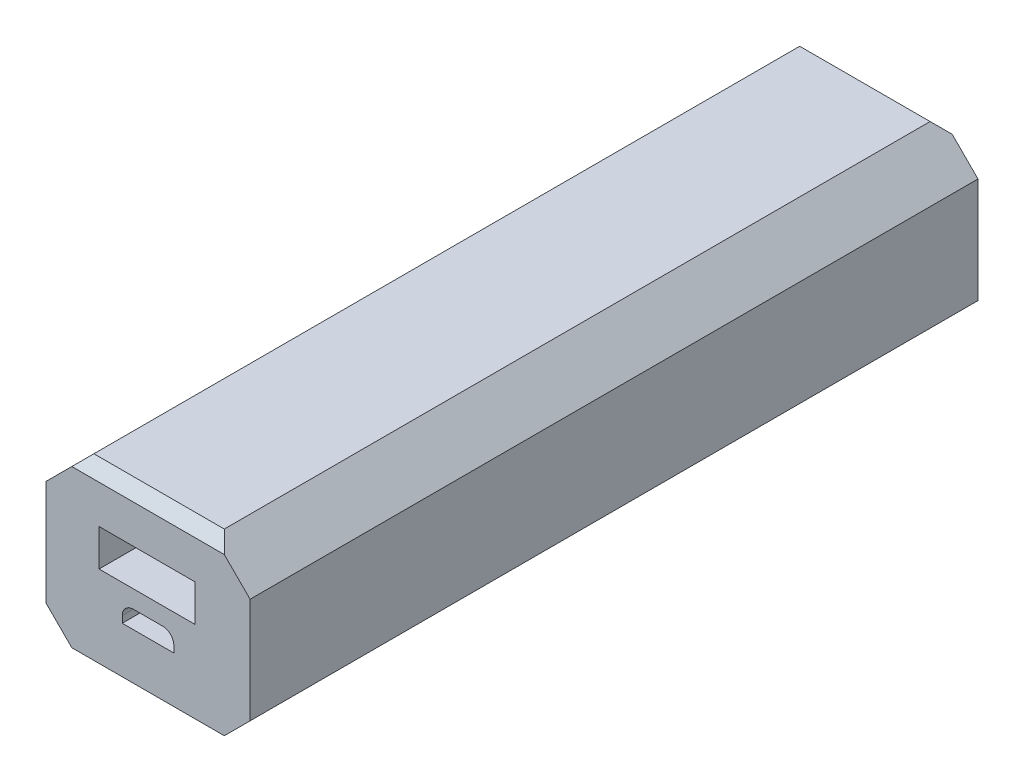
ISO-10303-21;
HEADER;
FILE_DESCRIPTION(('STEP AP214'),'2;1');
FILE_NAME('part.step','',(''),(''),'','','');
FILE_SCHEMA(('AUTOMOTIVE_DESIGN { 1 0 10303 214 1 1 1 1 }'));
ENDSEC;
DATA;
#1=APPLICATION_CONTEXT('core data for automotive mechanical design processes');
#2=APPLICATION_PROTOCOL_DEFINITION('international standard','automotive_design',2000,#1);
#3=PRODUCT_CONTEXT('',#1,'mechanical');
#4=PRODUCT('Part','Part','',(#3));
#5=PRODUCT_RELATED_PRODUCT_CATEGORY('part','',(#4));
#6=PRODUCT_DEFINITION_FORMATION('','',#4);
#7=PRODUCT_DEFINITION_CONTEXT('part definition',#1,'design');
#8=PRODUCT_DEFINITION('design','',#6,#7);
#9=PRODUCT_DEFINITION_SHAPE('','',#8);
#10=(LENGTH_UNIT() NAMED_UNIT(*) SI_UNIT(.MILLI.,.METRE.));
#11=(NAMED_UNIT(*) PLANE_ANGLE_UNIT() SI_UNIT($,.RADIAN.));
#12=(NAMED_UNIT(*) SI_UNIT($,.STERADIAN.) SOLID_ANGLE_UNIT());
#13=UNCERTAINTY_MEASURE_WITH_UNIT(LENGTH_MEASURE(1.E-05),#10,'distance_accuracy_value','');
#14=(GEOMETRIC_REPRESENTATION_CONTEXT(3) GLOBAL_UNCERTAINTY_ASSIGNED_CONTEXT((#13)) GLOBAL_UNIT_ASSIGNED_CONTEXT((#10,
#11,#12)) REPRESENTATION_CONTEXT('',''));
#15=CARTESIAN_POINT('',(0.,0.,0.));
#16=DIRECTION('',(0.,0.,1.));
#17=DIRECTION('',(1.,0.,0.));
#18=AXIS2_PLACEMENT_3D('',#15,#16,#17);
#19=CARTESIAN_POINT('',(0.,0.,98.8));
#20=DIRECTION('',(1.,0.,0.));
#21=DIRECTION('',(0.,0.,-1.));
#22=AXIS2_PLACEMENT_3D('',#19,#20,#21);
#23=PLANE('',#22);
#24=DIRECTION('',(0.,-1.,0.));
#25=VECTOR('',#24,1.);
#26=CARTESIAN_POINT('',(0.,0.,98.8));
#27=LINE('',#26,#25);
#28=CARTESIAN_POINT('',(0.,19.3,98.8));
#29=VERTEX_POINT('',#28);
#30=CARTESIAN_POINT('',(0.,5.,98.8));
#31=VERTEX_POINT('',#30);
#32=EDGE_CURVE('E286',#29,#31,#27,.T.);
#33=ORIENTED_EDGE('',*,*,#32,.F.);
#34=DIRECTION('',(0.,0.,-1.));
#35=VECTOR('',#34,1.);
#36=CARTESIAN_POINT('',(0.,19.3,98.8));
#37=LINE('',#36,#35);
#38=CARTESIAN_POINT('',(0.,19.3,0.));
#39=VERTEX_POINT('',#38);
#40=EDGE_CURVE('E304',#29,#39,#37,.T.);
#41=ORIENTED_EDGE('',*,*,#40,.T.);
#42=DIRECTION('',(0.,-1.,0.));
#43=VECTOR('',#42,1.);
#44=CARTESIAN_POINT('',(0.,0.,0.));
#45=LINE('',#44,#43);
#46=CARTESIAN_POINT('',(0.,5.,0.));
#47=VERTEX_POINT('',#46);
#48=EDGE_CURVE('E276',#39,#47,#45,.T.);
#49=ORIENTED_EDGE('',*,*,#48,.T.);
#50=DIRECTION('',(0.,0.,1.));
#51=VECTOR('',#50,1.);
#52=CARTESIAN_POINT('',(0.,5.,98.8));
#53=LINE('',#52,#51);
#54=EDGE_CURVE('E295',#47,#31,#53,.T.);
#55=ORIENTED_EDGE('',*,*,#54,.T.);
#56=EDGE_LOOP('',(#33,#41,#49,#55));
#57=FACE_BOUND('',#56,.T.);
#58=ADVANCED_FACE('F47',(#57),#23,.F.);
#59=CARTESIAN_POINT('',(0.,0.,98.8));
#60=DIRECTION('',(0.,1.,0.));
#61=DIRECTION('',(0.,0.,1.));
#62=AXIS2_PLACEMENT_3D('',#59,#60,#61);
#63=PLANE('',#62);
#64=DIRECTION('',(0.,0.,-1.));
#65=VECTOR('',#64,1.);
#66=CARTESIAN_POINT('',(4.99999999999999,0.,98.8));
#67=LINE('',#66,#65);
#68=CARTESIAN_POINT('',(4.99999999999999,0.,97.3));
#69=VERTEX_POINT('',#68);
#70=CARTESIAN_POINT('',(4.99999999999999,0.,1.49999999999999));
#71=VERTEX_POINT('',#70);
#72=EDGE_CURVE('E348',#69,#71,#67,.T.);
#73=ORIENTED_EDGE('',*,*,#72,.T.);
#74=DIRECTION('',(1.,0.,0.));
#75=VECTOR('',#74,1.);
#76=CARTESIAN_POINT('',(22.7,0.,1.49999999999999));
#77=LINE('',#76,#75);
#78=CARTESIAN_POINT('',(22.7,0.,1.49999999999999));
#79=VERTEX_POINT('',#78);
#80=EDGE_CURVE('E362',#71,#79,#77,.T.);
#81=ORIENTED_EDGE('',*,*,#80,.T.);
#82=DIRECTION('',(0.,0.,1.));
#83=VECTOR('',#82,1.);
#84=CARTESIAN_POINT('',(22.7,0.,98.8));
#85=LINE('',#84,#83);
#86=CARTESIAN_POINT('',(22.7,0.,97.3));
#87=VERTEX_POINT('',#86);
#88=EDGE_CURVE('E344',#79,#87,#85,.T.);
#89=ORIENTED_EDGE('',*,*,#88,.T.);
#90=DIRECTION('',(-1.,0.,0.));
#91=VECTOR('',#90,1.);
#92=CARTESIAN_POINT('',(0.,0.,97.3));
#93=LINE('',#92,#91);
#94=EDGE_CURVE('E359',#87,#69,#93,.T.);
#95=ORIENTED_EDGE('',*,*,#94,.T.);
#96=EDGE_LOOP('',(#73,#81,#89,#95));
#97=FACE_BOUND('',#96,.T.);
#98=ADVANCED_FACE('F449',(#97),#63,.F.);
#99=CARTESIAN_POINT('',(27.7,0.,98.8));
#100=DIRECTION('',(-1.,0.,0.));
#101=DIRECTION('',(0.,0.,1.));
#102=AXIS2_PLACEMENT_3D('',#99,#100,#101);
#103=PLANE('',#102);
#104=DIRECTION('',(0.,1.,0.));
#105=VECTOR('',#104,1.);
#106=CARTESIAN_POINT('',(27.7,0.,98.8));
#107=LINE('',#106,#105);
#108=CARTESIAN_POINT('',(27.7,4.99999999999999,98.8));
#109=VERTEX_POINT('',#108);
#110=CARTESIAN_POINT('',(27.7,19.3,98.8));
#111=VERTEX_POINT('',#110);
#112=EDGE_CURVE('E290',#109,#111,#107,.T.);
#113=ORIENTED_EDGE('',*,*,#112,.F.);
#114=DIRECTION('',(0.,0.,-1.));
#115=VECTOR('',#114,1.);
#116=CARTESIAN_POINT('',(27.7,4.99999999999999,98.8));
#117=LINE('',#116,#115);
#118=CARTESIAN_POINT('',(27.7,4.99999999999999,0.));
#119=VERTEX_POINT('',#118);
#120=EDGE_CURVE('E355',#109,#119,#117,.T.);
#121=ORIENTED_EDGE('',*,*,#120,.T.);
#122=DIRECTION('',(0.,1.,0.));
#123=VECTOR('',#122,1.);
#124=CARTESIAN_POINT('',(27.7,0.,0.));
#125=LINE('',#124,#123);
#126=CARTESIAN_POINT('',(27.7,19.3,0.));
#127=VERTEX_POINT('',#126);
#128=EDGE_CURVE('E291',#119,#127,#125,.T.);
#129=ORIENTED_EDGE('',*,*,#128,.T.);
#130=DIRECTION('',(0.,0.,1.));
#131=VECTOR('',#130,1.);
#132=CARTESIAN_POINT('',(27.7,19.3,98.8));
#133=LINE('',#132,#131);
#134=EDGE_CURVE('E352',#127,#111,#133,.T.);
#135=ORIENTED_EDGE('',*,*,#134,.T.);
#136=EDGE_LOOP('',(#113,#121,#129,#135));
#137=FACE_BOUND('',#136,.T.);
#138=ADVANCED_FACE('F456',(#137),#103,.F.);
#139=CARTESIAN_POINT('',(0.,24.3,98.8));
#140=DIRECTION('',(0.,-1.,0.));
#141=DIRECTION('',(0.,0.,-1.));
#142=AXIS2_PLACEMENT_3D('',#139,#140,#141);
#143=PLANE('',#142);
#144=DIRECTION('',(0.,0.,-1.));
#145=VECTOR('',#144,1.);
#146=CARTESIAN_POINT('',(22.7,24.3,98.8));
#147=LINE('',#146,#145);
#148=CARTESIAN_POINT('',(22.7,24.3,97.3));
#149=VERTEX_POINT('',#148);
#150=CARTESIAN_POINT('',(22.7,24.3,1.49999999999999));
#151=VERTEX_POINT('',#150);
#152=EDGE_CURVE('E322',#149,#151,#147,.T.);
#153=ORIENTED_EDGE('',*,*,#152,.T.);
#154=DIRECTION('',(-1.,0.,0.));
#155=VECTOR('',#154,1.);
#156=CARTESIAN_POINT('',(5.,24.3,1.49999999999999));
#157=LINE('',#156,#155);
#158=CARTESIAN_POINT('',(5.,24.3,1.49999999999999));
#159=VERTEX_POINT('',#158);
#160=EDGE_CURVE('E395',#151,#159,#157,.T.);
#161=ORIENTED_EDGE('',*,*,#160,.T.);
#162=DIRECTION('',(0.,0.,1.));
#163=VECTOR('',#162,1.);
#164=CARTESIAN_POINT('',(5.,24.3,98.8));
#165=LINE('',#164,#163);
#166=CARTESIAN_POINT('',(5.,24.3,97.3));
#167=VERTEX_POINT('',#166);
#168=EDGE_CURVE('E326',#159,#167,#165,.T.);
#169=ORIENTED_EDGE('',*,*,#168,.T.);
#170=DIRECTION('',(1.,0.,0.));
#171=VECTOR('',#170,1.);
#172=CARTESIAN_POINT('',(0.,24.3,97.3));
#173=LINE('',#172,#171);
#174=EDGE_CURVE('E392',#167,#149,#173,.T.);
#175=ORIENTED_EDGE('',*,*,#174,.T.);
#176=EDGE_LOOP('',(#153,#161,#169,#175));
#177=FACE_BOUND('',#176,.T.);
#178=ADVANCED_FACE('F558',(#177),#143,.F.);
#179=CARTESIAN_POINT('',(0.,0.,98.8));
#180=DIRECTION('',(0.,0.,-1.));
#181=DIRECTION('',(-1.,0.,0.));
#182=AXIS2_PLACEMENT_3D('',#179,#180,#181);
#183=PLANE('',#182);
#184=DIRECTION('',(1.,0.,0.));
#185=VECTOR('',#184,1.);
#186=CARTESIAN_POINT('',(10.35,7.8004353239189,98.8));
#187=LINE('',#186,#185);
#188=CARTESIAN_POINT('',(10.35,7.8004353239189,98.8));
#189=VERTEX_POINT('',#188);
#190=CARTESIAN_POINT('',(17.35,7.8004353239189,98.8));
#191=VERTEX_POINT('',#190);
#192=EDGE_CURVE('E229',#189,#191,#187,.T.);
#193=ORIENTED_EDGE('',*,*,#192,.F.);
#194=DIRECTION('',(0.,-1.,0.));
#195=VECTOR('',#194,1.);
#196=CARTESIAN_POINT('',(10.35,10.2004353239189,98.8));
#197=LINE('',#196,#195);
#198=CARTESIAN_POINT('',(10.35,8.7004353239189,98.8));
#199=VERTEX_POINT('',#198);
#200=EDGE_CURVE('E209',#199,#189,#197,.T.);
#201=ORIENTED_EDGE('',*,*,#200,.F.);
#202=CARTESIAN_POINT('',(11.85,8.7004353239189,98.8));
#203=DIRECTION('',(0.,0.,-1.));
#204=DIRECTION('',(-1.,0.,0.));
#205=AXIS2_PLACEMENT_3D('',#202,#203,#204);
#206=CIRCLE('',#205,1.5);
#207=CARTESIAN_POINT('',(11.85,10.2004353239189,98.8));
#208=VERTEX_POINT('',#207);
#209=EDGE_CURVE('E11',#199,#208,#206,.T.);
#210=ORIENTED_EDGE('',*,*,#209,.T.);
#211=DIRECTION('',(-1.,0.,0.));
#212=VECTOR('',#211,1.);
#213=CARTESIAN_POINT('',(10.35,10.2004353239189,98.8));
#214=LINE('',#213,#212);
#215=CARTESIAN_POINT('',(15.85,10.2004353239189,98.8));
#216=VERTEX_POINT('',#215);
#217=EDGE_CURVE('E203',#216,#208,#214,.T.);
#218=ORIENTED_EDGE('',*,*,#217,.F.);
#219=CARTESIAN_POINT('',(15.85,8.7004353239189,98.8));
#220=DIRECTION('',(0.,0.,-1.));
#221=DIRECTION('',(-1.,0.,0.));
#222=AXIS2_PLACEMENT_3D('',#219,#220,#221);
#223=CIRCLE('',#222,1.5);
#224=CARTESIAN_POINT('',(17.35,8.7004353239189,98.8));
#225=VERTEX_POINT('',#224);
#226=EDGE_CURVE('E56',#216,#225,#223,.T.);
#227=ORIENTED_EDGE('',*,*,#226,.T.);
#228=DIRECTION('',(0.,1.,0.));
#229=VECTOR('',#228,1.);
#230=CARTESIAN_POINT('',(17.35,10.2004353239189,98.8));
#231=LINE('',#230,#229);
#232=EDGE_CURVE('E232',#191,#225,#231,.T.);
#233=ORIENTED_EDGE('',*,*,#232,.F.);
#234=EDGE_LOOP('',(#193,#201,#210,#218,#227,#233));
#235=FACE_BOUND('',#234,.T.);
#236=DIRECTION('',(1.,0.,0.));
#237=VECTOR('',#236,1.);
#238=CARTESIAN_POINT('',(7.2,12.6004353239189,98.8));
#239=LINE('',#238,#237);
#240=CARTESIAN_POINT('',(7.2,12.6004353239189,98.8));
#241=VERTEX_POINT('',#240);
#242=CARTESIAN_POINT('',(20.2,12.6004353239189,98.8));
#243=VERTEX_POINT('',#242);
#244=EDGE_CURVE('E262',#241,#243,#239,.T.);
#245=ORIENTED_EDGE('',*,*,#244,.F.);
#246=DIRECTION('',(0.,-1.,0.));
#247=VECTOR('',#246,1.);
#248=CARTESIAN_POINT('',(7.2,17.6004353239189,98.8));
#249=LINE('',#248,#247);
#250=CARTESIAN_POINT('',(7.2,17.6004353239189,98.8));
#251=VERTEX_POINT('',#250);
#252=EDGE_CURVE('E240',#251,#241,#249,.T.);
#253=ORIENTED_EDGE('',*,*,#252,.F.);
#254=DIRECTION('',(-1.,0.,0.));
#255=VECTOR('',#254,1.);
#256=CARTESIAN_POINT('',(7.2,17.6004353239189,98.8));
#257=LINE('',#256,#255);
#258=CARTESIAN_POINT('',(20.2,17.6004353239189,98.8));
#259=VERTEX_POINT('',#258);
#260=EDGE_CURVE('E247',#259,#251,#257,.T.);
#261=ORIENTED_EDGE('',*,*,#260,.F.);
#262=DIRECTION('',(0.,1.,0.));
#263=VECTOR('',#262,1.);
#264=CARTESIAN_POINT('',(20.2,17.6004353239189,98.8));
#265=LINE('',#264,#263);
#266=EDGE_CURVE('E266',#243,#259,#265,.T.);
#267=ORIENTED_EDGE('',*,*,#266,.F.);
#268=EDGE_LOOP('',(#245,#253,#261,#267));
#269=FACE_BOUND('',#268,.T.);
#270=DIRECTION('',(-0.707106781186547,0.707106781186549,0.));
#271=VECTOR('',#270,1.);
#272=CARTESIAN_POINT('',(4.99999999999999,0.,98.8));
#273=LINE('',#272,#271);
#274=CARTESIAN_POINT('',(3.50000000000001,1.49999999999999,98.8));
#275=VERTEX_POINT('',#274);
#276=EDGE_CURVE('E337',#31,#275,#273,.F.);
#277=ORIENTED_EDGE('',*,*,#276,.T.);
#278=DIRECTION('',(1.,0.,0.));
#279=VECTOR('',#278,1.);
#280=CARTESIAN_POINT('',(0.,1.49999999999999,98.8));
#281=LINE('',#280,#279);
#282=CARTESIAN_POINT('',(24.2,1.49999999999999,98.8));
#283=VERTEX_POINT('',#282);
#284=EDGE_CURVE('E388',#275,#283,#281,.T.);
#285=ORIENTED_EDGE('',*,*,#284,.T.);
#286=DIRECTION('',(-0.707106781186549,-0.707106781186547,0.));
#287=VECTOR('',#286,1.);
#288=CARTESIAN_POINT('',(27.7,4.99999999999999,98.8));
#289=LINE('',#288,#287);
#290=EDGE_CURVE('E334',#283,#109,#289,.F.);
#291=ORIENTED_EDGE('',*,*,#290,.T.);
#292=ORIENTED_EDGE('',*,*,#112,.T.);
#293=DIRECTION('',(0.707106781186547,-0.707106781186549,0.));
#294=VECTOR('',#293,1.);
#295=CARTESIAN_POINT('',(22.7,24.3,98.8));
#296=LINE('',#295,#294);
#297=CARTESIAN_POINT('',(24.2,22.8,98.8));
#298=VERTEX_POINT('',#297);
#299=EDGE_CURVE('E330',#111,#298,#296,.F.);
#300=ORIENTED_EDGE('',*,*,#299,.T.);
#301=DIRECTION('',(-1.,0.,0.));
#302=VECTOR('',#301,1.);
#303=CARTESIAN_POINT('',(0.,22.8,98.8));
#304=LINE('',#303,#302);
#305=CARTESIAN_POINT('',(3.50000000000001,22.8,98.8));
#306=VERTEX_POINT('',#305);
#307=EDGE_CURVE('E384',#298,#306,#304,.T.);
#308=ORIENTED_EDGE('',*,*,#307,.T.);
#309=DIRECTION('',(0.707106781186549,0.707106781186547,0.));
#310=VECTOR('',#309,1.);
#311=CARTESIAN_POINT('',(0.,19.3,98.8));
#312=LINE('',#311,#310);
#313=EDGE_CURVE('E341',#306,#29,#312,.F.);
#314=ORIENTED_EDGE('',*,*,#313,.T.);
#315=ORIENTED_EDGE('',*,*,#32,.T.);
#316=EDGE_LOOP('',(#277,#285,#291,#292,#300,#308,#314,#315));
#317=FACE_BOUND('',#316,.T.);
#318=ADVANCED_FACE('F432',(#235,#269,#317),#183,.F.);
#319=CARTESIAN_POINT('',(0.,0.,0.));
#320=DIRECTION('',(0.,0.,-1.));
#321=DIRECTION('',(-1.,0.,0.));
#322=AXIS2_PLACEMENT_3D('',#319,#320,#321);
#323=PLANE('',#322);
#324=DIRECTION('',(0.707106781186549,0.707106781186547,0.));
#325=VECTOR('',#324,1.);
#326=CARTESIAN_POINT('',(11.35,-11.35,0.));
#327=LINE('',#326,#325);
#328=CARTESIAN_POINT('',(24.2,1.5,0.));
#329=VERTEX_POINT('',#328);
#330=EDGE_CURVE('E311',#119,#329,#327,.F.);
#331=ORIENTED_EDGE('',*,*,#330,.T.);
#332=DIRECTION('',(-1.,0.,0.));
#333=VECTOR('',#332,1.);
#334=CARTESIAN_POINT('',(4.99999999999999,1.5,0.));
#335=LINE('',#334,#333);
#336=CARTESIAN_POINT('',(3.49999999999999,1.5,0.));
#337=VERTEX_POINT('',#336);
#338=EDGE_CURVE('E375',#329,#337,#335,.T.);
#339=ORIENTED_EDGE('',*,*,#338,.T.);
#340=DIRECTION('',(0.707106781186547,-0.707106781186549,0.));
#341=VECTOR('',#340,1.);
#342=CARTESIAN_POINT('',(2.5,2.5,0.));
#343=LINE('',#342,#341);
#344=EDGE_CURVE('E315',#337,#47,#343,.F.);
#345=ORIENTED_EDGE('',*,*,#344,.T.);
#346=ORIENTED_EDGE('',*,*,#48,.F.);
#347=DIRECTION('',(-0.707106781186549,-0.707106781186547,0.));
#348=VECTOR('',#347,1.);
#349=CARTESIAN_POINT('',(-9.65000000000001,9.65000000000004,0.));
#350=LINE('',#349,#348);
#351=CARTESIAN_POINT('',(3.5,22.8,0.));
#352=VERTEX_POINT('',#351);
#353=EDGE_CURVE('E318',#39,#352,#350,.F.);
#354=ORIENTED_EDGE('',*,*,#353,.T.);
#355=DIRECTION('',(1.,0.,0.));
#356=VECTOR('',#355,1.);
#357=CARTESIAN_POINT('',(22.7,22.8,0.));
#358=LINE('',#357,#356);
#359=CARTESIAN_POINT('',(24.2,22.8,0.));
#360=VERTEX_POINT('',#359);
#361=EDGE_CURVE('E372',#352,#360,#358,.T.);
#362=ORIENTED_EDGE('',*,*,#361,.T.);
#363=DIRECTION('',(-0.707106781186547,0.707106781186549,0.));
#364=VECTOR('',#363,1.);
#365=CARTESIAN_POINT('',(23.5,23.5,0.));
#366=LINE('',#365,#364);
#367=EDGE_CURVE('E308',#360,#127,#366,.F.);
#368=ORIENTED_EDGE('',*,*,#367,.T.);
#369=ORIENTED_EDGE('',*,*,#128,.F.);
#370=EDGE_LOOP('',(#331,#339,#345,#346,#354,#362,#368,#369));
#371=FACE_BOUND('',#370,.T.);
#372=ADVANCED_FACE('F470',(#371),#323,.T.);
#373=CARTESIAN_POINT('',(0.,19.3,98.8));
#374=DIRECTION('',(0.707106781186546,-0.707106781186548,0.));
#375=DIRECTION('',(0.,0.,-1.));
#376=AXIS2_PLACEMENT_3D('',#373,#374,#375);
#377=PLANE('',#376);
#378=ORIENTED_EDGE('',*,*,#168,.F.);
#379=DIRECTION('',(0.577350269189629,0.577350269189627,0.577350269189622));
#380=VECTOR('',#379,1.);
#381=CARTESIAN_POINT('',(34.0999999999999,53.3999999999998,30.5999999999996));
#382=LINE('',#381,#380);
#383=EDGE_CURVE('E402',#159,#352,#382,.F.);
#384=ORIENTED_EDGE('',*,*,#383,.T.);
#385=ORIENTED_EDGE('',*,*,#353,.F.);
#386=ORIENTED_EDGE('',*,*,#40,.F.);
#387=ORIENTED_EDGE('',*,*,#313,.F.);
#388=DIRECTION('',(0.577350269189625,0.577350269189623,-0.577350269189629));
#389=VECTOR('',#388,1.);
#390=CARTESIAN_POINT('',(1.16666666666668,20.4666666666667,101.133333333333));
#391=LINE('',#390,#389);
#392=EDGE_CURVE('E399',#306,#167,#391,.T.);
#393=ORIENTED_EDGE('',*,*,#392,.T.);
#394=EDGE_LOOP('',(#378,#384,#385,#386,#387,#393));
#395=FACE_BOUND('',#394,.T.);
#396=ADVANCED_FACE('F463',(#395),#377,.F.);
#397=CARTESIAN_POINT('',(4.99999999999999,0.,98.8));
#398=DIRECTION('',(0.707106781186548,0.707106781186546,0.));
#399=DIRECTION('',(0.,0.,-1.));
#400=AXIS2_PLACEMENT_3D('',#397,#398,#399);
#401=PLANE('',#400);
#402=ORIENTED_EDGE('',*,*,#344,.F.);
#403=DIRECTION('',(-0.577350269189627,0.577350269189628,-0.577350269189623));
#404=VECTOR('',#403,1.);
#405=CARTESIAN_POINT('',(37.4333333333332,-32.4333333333333,33.933333333333));
#406=LINE('',#405,#404);
#407=EDGE_CURVE('E381',#337,#71,#406,.F.);
#408=ORIENTED_EDGE('',*,*,#407,.T.);
#409=ORIENTED_EDGE('',*,*,#72,.F.);
#410=DIRECTION('',(-0.577350269189623,0.577350269189625,0.57735026918963));
#411=VECTOR('',#410,1.);
#412=CARTESIAN_POINT('',(4.49999999999999,0.500000000000003,97.8));
#413=LINE('',#412,#411);
#414=EDGE_CURVE('E378',#69,#275,#413,.T.);
#415=ORIENTED_EDGE('',*,*,#414,.T.);
#416=ORIENTED_EDGE('',*,*,#276,.F.);
#417=ORIENTED_EDGE('',*,*,#54,.F.);
#418=EDGE_LOOP('',(#402,#408,#409,#415,#416,#417));
#419=FACE_BOUND('',#418,.T.);
#420=ADVANCED_FACE('F469',(#419),#401,.F.);
#421=CARTESIAN_POINT('',(27.7,4.99999999999999,98.8));
#422=DIRECTION('',(-0.707106781186546,0.707106781186548,0.));
#423=DIRECTION('',(0.,0.,-1.));
#424=AXIS2_PLACEMENT_3D('',#421,#422,#423);
#425=PLANE('',#424);
#426=ORIENTED_EDGE('',*,*,#88,.F.);
#427=DIRECTION('',(-0.577350269189629,-0.577350269189627,0.577350269189622));
#428=VECTOR('',#427,1.);
#429=CARTESIAN_POINT('',(-6.39999999999991,-29.0999999999998,30.5999999999996));
#430=LINE('',#429,#428);
#431=EDGE_CURVE('E369',#79,#329,#430,.F.);
#432=ORIENTED_EDGE('',*,*,#431,.T.);
#433=ORIENTED_EDGE('',*,*,#330,.F.);
#434=ORIENTED_EDGE('',*,*,#120,.F.);
#435=ORIENTED_EDGE('',*,*,#290,.F.);
#436=DIRECTION('',(-0.577350269189625,-0.577350269189623,-0.577350269189629));
#437=VECTOR('',#436,1.);
#438=CARTESIAN_POINT('',(26.5333333333333,3.83333333333331,101.133333333333));
#439=LINE('',#438,#437);
#440=EDGE_CURVE('E366',#283,#87,#439,.T.);
#441=ORIENTED_EDGE('',*,*,#440,.T.);
#442=EDGE_LOOP('',(#426,#432,#433,#434,#435,#441));
#443=FACE_BOUND('',#442,.T.);
#444=ADVANCED_FACE('F477',(#443),#425,.F.);
#445=CARTESIAN_POINT('',(22.7,24.3,98.8));
#446=DIRECTION('',(-0.707106781186548,-0.707106781186546,0.));
#447=DIRECTION('',(0.,0.,-1.));
#448=AXIS2_PLACEMENT_3D('',#445,#446,#447);
#449=PLANE('',#448);
#450=ORIENTED_EDGE('',*,*,#367,.F.);
#451=DIRECTION('',(0.577350269189627,-0.577350269189628,-0.577350269189623));
#452=VECTOR('',#451,1.);
#453=CARTESIAN_POINT('',(-9.73333333333321,56.7333333333333,33.933333333333));
#454=LINE('',#453,#452);
#455=EDGE_CURVE('E408',#360,#151,#454,.F.);
#456=ORIENTED_EDGE('',*,*,#455,.T.);
#457=ORIENTED_EDGE('',*,*,#152,.F.);
#458=DIRECTION('',(0.577350269189623,-0.577350269189625,0.57735026918963));
#459=VECTOR('',#458,1.);
#460=CARTESIAN_POINT('',(23.2,23.8,97.8));
#461=LINE('',#460,#459);
#462=EDGE_CURVE('E405',#149,#298,#461,.T.);
#463=ORIENTED_EDGE('',*,*,#462,.T.);
#464=ORIENTED_EDGE('',*,*,#299,.F.);
#465=ORIENTED_EDGE('',*,*,#134,.F.);
#466=EDGE_LOOP('',(#450,#456,#457,#463,#464,#465));
#467=FACE_BOUND('',#466,.T.);
#468=ADVANCED_FACE('F484',(#467),#449,.F.);
#469=CARTESIAN_POINT('',(0.,0.,1.49999999999999));
#470=DIRECTION('',(0.,-0.707106781186544,-0.707106781186551));
#471=DIRECTION('',(-1.,0.,0.));
#472=AXIS2_PLACEMENT_3D('',#469,#470,#471);
#473=PLANE('',#472);
#474=ORIENTED_EDGE('',*,*,#407,.F.);
#475=ORIENTED_EDGE('',*,*,#338,.F.);
#476=ORIENTED_EDGE('',*,*,#431,.F.);
#477=ORIENTED_EDGE('',*,*,#80,.F.);
#478=EDGE_LOOP('',(#474,#475,#476,#477));
#479=FACE_BOUND('',#478,.T.);
#480=ADVANCED_FACE('F491',(#479),#473,.T.);
#481=CARTESIAN_POINT('',(0.,1.49999999999999,98.8));
#482=DIRECTION('',(0.,0.707106781186551,-0.707106781186544));
#483=DIRECTION('',(1.,0.,0.));
#484=AXIS2_PLACEMENT_3D('',#481,#482,#483);
#485=PLANE('',#484);
#486=ORIENTED_EDGE('',*,*,#414,.F.);
#487=ORIENTED_EDGE('',*,*,#94,.F.);
#488=ORIENTED_EDGE('',*,*,#440,.F.);
#489=ORIENTED_EDGE('',*,*,#284,.F.);
#490=EDGE_LOOP('',(#486,#487,#488,#489));
#491=FACE_BOUND('',#490,.T.);
#492=ADVANCED_FACE('F498',(#491),#485,.F.);
#493=CARTESIAN_POINT('',(0.,24.3,1.49999999999999));
#494=DIRECTION('',(0.,0.707106781186544,-0.707106781186551));
#495=DIRECTION('',(1.,0.,0.));
#496=AXIS2_PLACEMENT_3D('',#493,#494,#495);
#497=PLANE('',#496);
#498=ORIENTED_EDGE('',*,*,#455,.F.);
#499=ORIENTED_EDGE('',*,*,#361,.F.);
#500=ORIENTED_EDGE('',*,*,#383,.F.);
#501=ORIENTED_EDGE('',*,*,#160,.F.);
#502=EDGE_LOOP('',(#498,#499,#500,#501));
#503=FACE_BOUND('',#502,.T.);
#504=ADVANCED_FACE('F505',(#503),#497,.T.);
#505=CARTESIAN_POINT('',(0.,22.8,98.8));
#506=DIRECTION('',(0.,-0.707106781186551,-0.707106781186544));
#507=DIRECTION('',(-1.,0.,0.));
#508=AXIS2_PLACEMENT_3D('',#505,#506,#507);
#509=PLANE('',#508);
#510=ORIENTED_EDGE('',*,*,#462,.F.);
#511=ORIENTED_EDGE('',*,*,#174,.F.);
#512=ORIENTED_EDGE('',*,*,#392,.F.);
#513=ORIENTED_EDGE('',*,*,#307,.F.);
#514=EDGE_LOOP('',(#510,#511,#512,#513));
#515=FACE_BOUND('',#514,.T.);
#516=ADVANCED_FACE('F512',(#515),#509,.F.);
#517=CARTESIAN_POINT('',(7.2,17.6004353239189,83.8));
#518=DIRECTION('',(-1.,0.,0.));
#519=DIRECTION('',(0.,-1.,0.));
#520=AXIS2_PLACEMENT_3D('',#517,#518,#519);
#521=PLANE('',#520);
#522=ORIENTED_EDGE('',*,*,#252,.T.);
#523=DIRECTION('',(0.,0.,1.));
#524=VECTOR('',#523,1.);
#525=CARTESIAN_POINT('',(7.2,12.6004353239189,83.8));
#526=LINE('',#525,#524);
#527=CARTESIAN_POINT('',(7.2,12.6004353239189,83.8));
#528=VERTEX_POINT('',#527);
#529=EDGE_CURVE('E259',#528,#241,#526,.T.);
#530=ORIENTED_EDGE('',*,*,#529,.F.);
#531=DIRECTION('',(0.,-1.,0.));
#532=VECTOR('',#531,1.);
#533=CARTESIAN_POINT('',(7.2,17.6004353239189,83.8));
#534=LINE('',#533,#532);
#535=CARTESIAN_POINT('',(7.2,17.6004353239189,83.8));
#536=VERTEX_POINT('',#535);
#537=EDGE_CURVE('E242',#536,#528,#534,.T.);
#538=ORIENTED_EDGE('',*,*,#537,.F.);
#539=DIRECTION('',(0.,0.,1.));
#540=VECTOR('',#539,1.);
#541=CARTESIAN_POINT('',(7.2,17.6004353239189,83.8));
#542=LINE('',#541,#540);
#543=EDGE_CURVE('E273',#536,#251,#542,.T.);
#544=ORIENTED_EDGE('',*,*,#543,.T.);
#545=EDGE_LOOP('',(#522,#530,#538,#544));
#546=FACE_BOUND('',#545,.T.);
#547=ADVANCED_FACE('F517',(#546),#521,.F.);
#548=CARTESIAN_POINT('',(7.2,17.6004353239189,83.8));
#549=DIRECTION('',(0.,1.,0.));
#550=DIRECTION('',(0.,0.,1.));
#551=AXIS2_PLACEMENT_3D('',#548,#549,#550);
#552=PLANE('',#551);
#553=ORIENTED_EDGE('',*,*,#260,.T.);
#554=ORIENTED_EDGE('',*,*,#543,.F.);
#555=DIRECTION('',(-1.,0.,0.));
#556=VECTOR('',#555,1.);
#557=CARTESIAN_POINT('',(7.2,17.6004353239189,83.8));
#558=LINE('',#557,#556);
#559=CARTESIAN_POINT('',(20.2,17.6004353239189,83.8));
#560=VERTEX_POINT('',#559);
#561=EDGE_CURVE('E255',#560,#536,#558,.T.);
#562=ORIENTED_EDGE('',*,*,#561,.F.);
#563=DIRECTION('',(0.,0.,1.));
#564=VECTOR('',#563,1.);
#565=CARTESIAN_POINT('',(20.2,17.6004353239189,83.8));
#566=LINE('',#565,#564);
#567=EDGE_CURVE('E277',#560,#259,#566,.T.);
#568=ORIENTED_EDGE('',*,*,#567,.T.);
#569=EDGE_LOOP('',(#553,#554,#562,#568));
#570=FACE_BOUND('',#569,.T.);
#571=ADVANCED_FACE('F522',(#570),#552,.F.);
#572=CARTESIAN_POINT('',(20.2,17.6004353239189,83.8));
#573=DIRECTION('',(1.,0.,0.));
#574=DIRECTION('',(0.,0.,-1.));
#575=AXIS2_PLACEMENT_3D('',#572,#573,#574);
#576=PLANE('',#575);
#577=ORIENTED_EDGE('',*,*,#266,.T.);
#578=ORIENTED_EDGE('',*,*,#567,.F.);
#579=DIRECTION('',(0.,1.,0.));
#580=VECTOR('',#579,1.);
#581=CARTESIAN_POINT('',(20.2,17.6004353239189,83.8));
#582=LINE('',#581,#580);
#583=CARTESIAN_POINT('',(20.2,12.6004353239189,83.8));
#584=VERTEX_POINT('',#583);
#585=EDGE_CURVE('E251',#584,#560,#582,.T.);
#586=ORIENTED_EDGE('',*,*,#585,.F.);
#587=DIRECTION('',(0.,0.,1.));
#588=VECTOR('',#587,1.);
#589=CARTESIAN_POINT('',(20.2,12.6004353239189,83.8));
#590=LINE('',#589,#588);
#591=EDGE_CURVE('E280',#584,#243,#590,.T.);
#592=ORIENTED_EDGE('',*,*,#591,.T.);
#593=EDGE_LOOP('',(#577,#578,#586,#592));
#594=FACE_BOUND('',#593,.T.);
#595=ADVANCED_FACE('F572',(#594),#576,.F.);
#596=CARTESIAN_POINT('',(7.2,12.6004353239189,83.8));
#597=DIRECTION('',(0.,-1.,0.));
#598=DIRECTION('',(0.,0.,-1.));
#599=AXIS2_PLACEMENT_3D('',#596,#597,#598);
#600=PLANE('',#599);
#601=ORIENTED_EDGE('',*,*,#244,.T.);
#602=ORIENTED_EDGE('',*,*,#591,.F.);
#603=DIRECTION('',(1.,0.,0.));
#604=VECTOR('',#603,1.);
#605=CARTESIAN_POINT('',(7.2,12.6004353239189,83.8));
#606=LINE('',#605,#604);
#607=EDGE_CURVE('E246',#528,#584,#606,.T.);
#608=ORIENTED_EDGE('',*,*,#607,.F.);
#609=ORIENTED_EDGE('',*,*,#529,.T.);
#610=EDGE_LOOP('',(#601,#602,#608,#609));
#611=FACE_BOUND('',#610,.T.);
#612=ADVANCED_FACE('F568',(#611),#600,.F.);
#613=CARTESIAN_POINT('',(0.,0.,83.8));
#614=DIRECTION('',(0.,0.,1.));
#615=DIRECTION('',(1.,0.,0.));
#616=AXIS2_PLACEMENT_3D('',#613,#614,#615);
#617=PLANE('',#616);
#618=ORIENTED_EDGE('',*,*,#537,.T.);
#619=ORIENTED_EDGE('',*,*,#607,.T.);
#620=ORIENTED_EDGE('',*,*,#585,.T.);
#621=ORIENTED_EDGE('',*,*,#561,.T.);
#622=EDGE_LOOP('',(#618,#619,#620,#621));
#623=FACE_BOUND('',#622,.T.);
#624=ADVANCED_FACE('F571',(#623),#617,.T.);
#625=CARTESIAN_POINT('',(10.35,10.2004353239189,88.8));
#626=DIRECTION('',(-1.,0.,0.));
#627=DIRECTION('',(0.,0.,1.));
#628=AXIS2_PLACEMENT_3D('',#625,#626,#627);
#629=PLANE('',#628);
#630=DIRECTION('',(0.,-1.,0.));
#631=VECTOR('',#630,1.);
#632=CARTESIAN_POINT('',(10.35,10.2004353239189,88.8));
#633=LINE('',#632,#631);
#634=CARTESIAN_POINT('',(10.35,8.7004353239189,88.8));
#635=VERTEX_POINT('',#634);
#636=CARTESIAN_POINT('',(10.35,7.8004353239189,88.8));
#637=VERTEX_POINT('',#636);
#638=EDGE_CURVE('E195',#635,#637,#633,.T.);
#639=ORIENTED_EDGE('',*,*,#638,.F.);
#640=DIRECTION('',(0.,0.,1.));
#641=VECTOR('',#640,1.);
#642=CARTESIAN_POINT('',(10.35,8.7004353239189,98.8));
#643=LINE('',#642,#641);
#644=EDGE_CURVE('E426',#635,#199,#643,.T.);
#645=ORIENTED_EDGE('',*,*,#644,.T.);
#646=ORIENTED_EDGE('',*,*,#200,.T.);
#647=DIRECTION('',(0.,0.,1.));
#648=VECTOR('',#647,1.);
#649=CARTESIAN_POINT('',(10.35,7.8004353239189,88.8));
#650=LINE('',#649,#648);
#651=EDGE_CURVE('E206',#637,#189,#650,.T.);
#652=ORIENTED_EDGE('',*,*,#651,.F.);
#653=EDGE_LOOP('',(#639,#645,#646,#652));
#654=FACE_BOUND('',#653,.T.);
#655=ADVANCED_FACE('F207',(#654),#629,.F.);
#656=CARTESIAN_POINT('',(10.35,10.2004353239189,88.8));
#657=DIRECTION('',(0.,1.,0.));
#658=DIRECTION('',(0.,0.,1.));
#659=AXIS2_PLACEMENT_3D('',#656,#657,#658);
#660=PLANE('',#659);
#661=DIRECTION('',(-1.,0.,0.));
#662=VECTOR('',#661,1.);
#663=CARTESIAN_POINT('',(10.35,10.2004353239189,88.8));
#664=LINE('',#663,#662);
#665=CARTESIAN_POINT('',(15.85,10.2004353239189,88.8));
#666=VERTEX_POINT('',#665);
#667=CARTESIAN_POINT('',(11.85,10.2004353239189,88.8));
#668=VERTEX_POINT('',#667);
#669=EDGE_CURVE('E215',#666,#668,#664,.T.);
#670=ORIENTED_EDGE('',*,*,#669,.F.);
#671=DIRECTION('',(0.,0.,1.));
#672=VECTOR('',#671,1.);
#673=CARTESIAN_POINT('',(15.85,10.2004353239189,98.8));
#674=LINE('',#673,#672);
#675=EDGE_CURVE('E414',#666,#216,#674,.T.);
#676=ORIENTED_EDGE('',*,*,#675,.T.);
#677=ORIENTED_EDGE('',*,*,#217,.T.);
#678=DIRECTION('',(0.,0.,1.));
#679=VECTOR('',#678,1.);
#680=CARTESIAN_POINT('',(11.85,10.2004353239189,88.8));
#681=LINE('',#680,#679);
#682=EDGE_CURVE('E411',#208,#668,#681,.F.);
#683=ORIENTED_EDGE('',*,*,#682,.T.);
#684=EDGE_LOOP('',(#670,#676,#677,#683));
#685=FACE_BOUND('',#684,.T.);
#686=ADVANCED_FACE('F443',(#685),#660,.F.);
#687=CARTESIAN_POINT('',(17.35,10.2004353239189,88.8));
#688=DIRECTION('',(1.,0.,0.));
#689=DIRECTION('',(0.,0.,-1.));
#690=AXIS2_PLACEMENT_3D('',#687,#688,#689);
#691=PLANE('',#690);
#692=ORIENTED_EDGE('',*,*,#232,.T.);
#693=DIRECTION('',(0.,0.,1.));
#694=VECTOR('',#693,1.);
#695=CARTESIAN_POINT('',(17.35,8.7004353239189,88.8));
#696=LINE('',#695,#694);
#697=CARTESIAN_POINT('',(17.35,8.7004353239189,88.8));
#698=VERTEX_POINT('',#697);
#699=EDGE_CURVE('E418',#225,#698,#696,.F.);
#700=ORIENTED_EDGE('',*,*,#699,.T.);
#701=DIRECTION('',(0.,1.,0.));
#702=VECTOR('',#701,1.);
#703=CARTESIAN_POINT('',(17.35,10.2004353239189,88.8));
#704=LINE('',#703,#702);
#705=CARTESIAN_POINT('',(17.35,7.8004353239189,88.8));
#706=VERTEX_POINT('',#705);
#707=EDGE_CURVE('E220',#706,#698,#704,.T.);
#708=ORIENTED_EDGE('',*,*,#707,.F.);
#709=DIRECTION('',(0.,0.,1.));
#710=VECTOR('',#709,1.);
#711=CARTESIAN_POINT('',(17.35,7.8004353239189,88.8));
#712=LINE('',#711,#710);
#713=EDGE_CURVE('E214',#706,#191,#712,.T.);
#714=ORIENTED_EDGE('',*,*,#713,.T.);
#715=EDGE_LOOP('',(#692,#700,#708,#714));
#716=FACE_BOUND('',#715,.T.);
#717=ADVANCED_FACE('F438',(#716),#691,.F.);
#718=CARTESIAN_POINT('',(10.35,7.8004353239189,88.8));
#719=DIRECTION('',(0.,-1.,0.));
#720=DIRECTION('',(0.,0.,-1.));
#721=AXIS2_PLACEMENT_3D('',#718,#719,#720);
#722=PLANE('',#721);
#723=ORIENTED_EDGE('',*,*,#192,.T.);
#724=ORIENTED_EDGE('',*,*,#713,.F.);
#725=DIRECTION('',(1.,0.,0.));
#726=VECTOR('',#725,1.);
#727=CARTESIAN_POINT('',(10.35,7.8004353239189,88.8));
#728=LINE('',#727,#726);
#729=EDGE_CURVE('E200',#637,#706,#728,.T.);
#730=ORIENTED_EDGE('',*,*,#729,.F.);
#731=ORIENTED_EDGE('',*,*,#651,.T.);
#732=EDGE_LOOP('',(#723,#724,#730,#731));
#733=FACE_BOUND('',#732,.T.);
#734=ADVANCED_FACE('F217',(#733),#722,.F.);
#735=CARTESIAN_POINT('',(0.,0.,88.8));
#736=DIRECTION('',(0.,0.,1.));
#737=DIRECTION('',(1.,0.,0.));
#738=AXIS2_PLACEMENT_3D('',#735,#736,#737);
#739=PLANE('',#738);
#740=ORIENTED_EDGE('',*,*,#707,.T.);
#741=CARTESIAN_POINT('',(15.85,8.7004353239189,88.8));
#742=DIRECTION('',(0.,0.,1.));
#743=DIRECTION('',(1.,0.,0.));
#744=AXIS2_PLACEMENT_3D('',#741,#742,#743);
#745=CIRCLE('',#744,1.5);
#746=EDGE_CURVE('E423',#698,#666,#745,.T.);
#747=ORIENTED_EDGE('',*,*,#746,.T.);
#748=ORIENTED_EDGE('',*,*,#669,.T.);
#749=CARTESIAN_POINT('',(11.85,8.7004353239189,88.8));
#750=DIRECTION('',(0.,0.,1.));
#751=DIRECTION('',(1.,0.,0.));
#752=AXIS2_PLACEMENT_3D('',#749,#750,#751);
#753=CIRCLE('',#752,1.5);
#754=EDGE_CURVE('E69',#668,#635,#753,.T.);
#755=ORIENTED_EDGE('',*,*,#754,.T.);
#756=ORIENTED_EDGE('',*,*,#638,.T.);
#757=ORIENTED_EDGE('',*,*,#729,.T.);
#758=EDGE_LOOP('',(#740,#747,#748,#755,#756,#757));
#759=FACE_BOUND('',#758,.T.);
#760=ADVANCED_FACE('F198',(#759),#739,.T.);
#761=CARTESIAN_POINT('',(15.85,8.7004353239189,88.8));
#762=DIRECTION('',(0.,0.,-1.));
#763=DIRECTION('',(-1.,0.,0.));
#764=AXIS2_PLACEMENT_3D('',#761,#762,#763);
#765=CYLINDRICAL_SURFACE('',#764,1.5);
#766=ORIENTED_EDGE('',*,*,#746,.F.);
#767=ORIENTED_EDGE('',*,*,#699,.F.);
#768=ORIENTED_EDGE('',*,*,#226,.F.);
#769=ORIENTED_EDGE('',*,*,#675,.F.);
#770=EDGE_LOOP('',(#766,#767,#768,#769));
#771=FACE_BOUND('',#770,.T.);
#772=ADVANCED_FACE('F440',(#771),#765,.F.);
#773=CARTESIAN_POINT('',(11.85,8.7004353239189,88.8));
#774=DIRECTION('',(0.,0.,-1.));
#775=DIRECTION('',(-1.,0.,0.));
#776=AXIS2_PLACEMENT_3D('',#773,#774,#775);
#777=CYLINDRICAL_SURFACE('',#776,1.5);
#778=ORIENTED_EDGE('',*,*,#754,.F.);
#779=ORIENTED_EDGE('',*,*,#682,.F.);
#780=ORIENTED_EDGE('',*,*,#209,.F.);
#781=ORIENTED_EDGE('',*,*,#644,.F.);
#782=EDGE_LOOP('',(#778,#779,#780,#781));
#783=FACE_BOUND('',#782,.T.);
#784=ADVANCED_FACE('F49',(#783),#777,.F.);
#785=CLOSED_SHELL('',(#58,#98,#138,#178,#318,#372,#396,#420,#444,#468,#480,#492,#504,#516,#547,
#571,#595,#612,#624,#655,#686,#717,#734,#760,#772,#784));
#786=MANIFOLD_SOLID_BREP('B2',#785);
#787=ADVANCED_BREP_SHAPE_REPRESENTATION('',(#18,#786),#14);
#788=SHAPE_DEFINITION_REPRESENTATION(#9,#787);
ENDSEC;
END-ISO-10303-21;
